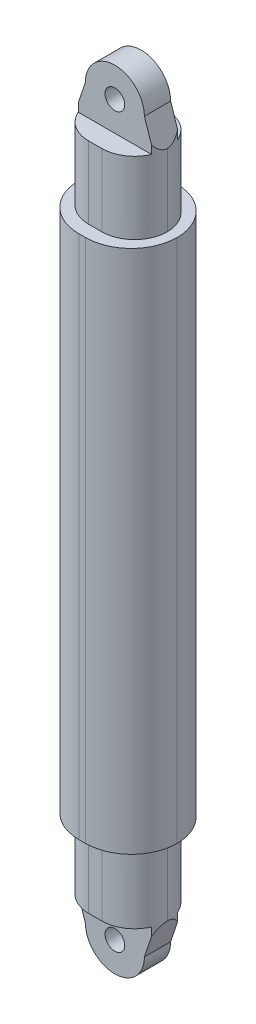
ISO-10303-21;
HEADER;
FILE_DESCRIPTION(('STEP AP214'),'2;1');
FILE_NAME('part.step','',(''),(''),'','','');
FILE_SCHEMA(('AUTOMOTIVE_DESIGN { 1 0 10303 214 1 1 1 1 }'));
ENDSEC;
DATA;
#1=APPLICATION_CONTEXT('core data for automotive mechanical design processes');
#2=APPLICATION_PROTOCOL_DEFINITION('international standard','automotive_design',2000,#1);
#3=PRODUCT_CONTEXT('',#1,'mechanical');
#4=PRODUCT('Part','Part','',(#3));
#5=PRODUCT_RELATED_PRODUCT_CATEGORY('part','',(#4));
#6=PRODUCT_DEFINITION_FORMATION('','',#4);
#7=PRODUCT_DEFINITION_CONTEXT('part definition',#1,'design');
#8=PRODUCT_DEFINITION('design','',#6,#7);
#9=PRODUCT_DEFINITION_SHAPE('','',#8);
#10=(LENGTH_UNIT() NAMED_UNIT(*) SI_UNIT(.MILLI.,.METRE.));
#11=(NAMED_UNIT(*) PLANE_ANGLE_UNIT() SI_UNIT($,.RADIAN.));
#12=(NAMED_UNIT(*) SI_UNIT($,.STERADIAN.) SOLID_ANGLE_UNIT());
#13=UNCERTAINTY_MEASURE_WITH_UNIT(LENGTH_MEASURE(1.E-05),#10,'distance_accuracy_value','');
#14=(GEOMETRIC_REPRESENTATION_CONTEXT(3) GLOBAL_UNCERTAINTY_ASSIGNED_CONTEXT((#13)) GLOBAL_UNIT_ASSIGNED_CONTEXT((#10,
#11,#12)) REPRESENTATION_CONTEXT('',''));
#15=CARTESIAN_POINT('',(0.,0.,0.));
#16=DIRECTION('',(0.,0.,1.));
#17=DIRECTION('',(1.,0.,0.));
#18=AXIS2_PLACEMENT_3D('',#15,#16,#17);
#19=CARTESIAN_POINT('',(-1.,0.,5.));
#20=DIRECTION('',(0.,-1.,0.));
#21=DIRECTION('',(0.,0.,-1.));
#22=AXIS2_PLACEMENT_3D('',#19,#20,#21);
#23=CYLINDRICAL_SURFACE('',#22,5.);
#24=CARTESIAN_POINT('',(-1.,-40.,5.));
#25=DIRECTION('',(0.,-1.,0.));
#26=DIRECTION('',(0.,0.,-1.));
#27=AXIS2_PLACEMENT_3D('',#24,#25,#26);
#28=CIRCLE('',#27,5.);
#29=CARTESIAN_POINT('',(-6.,-40.,5.));
#30=VERTEX_POINT('',#29);
#31=CARTESIAN_POINT('',(-1.,-40.,10.));
#32=VERTEX_POINT('',#31);
#33=EDGE_CURVE('E442',#30,#32,#28,.F.);
#34=ORIENTED_EDGE('',*,*,#33,.F.);
#35=DIRECTION('',(0.,-1.,0.));
#36=VECTOR('',#35,1.);
#37=CARTESIAN_POINT('',(-6.,-60.,5.));
#38=LINE('',#37,#36);
#39=CARTESIAN_POINT('',(-6.,-51.,5.));
#40=VERTEX_POINT('',#39);
#41=EDGE_CURVE('E560',#40,#30,#38,.F.);
#42=ORIENTED_EDGE('',*,*,#41,.F.);
#43=CARTESIAN_POINT('',(-1.,-66.,5.));
#44=DIRECTION('',(0.948683298050514,0.316227766016839,0.));
#45=DIRECTION('',(0.316227766016839,-0.948683298050514,0.));
#46=AXIS2_PLACEMENT_3D('',#43,#44,#45);
#47=ELLIPSE('',#46,15.8113883008419,5.);
#48=CARTESIAN_POINT('',(-5.58257569495584,-52.2522729151325,7.));
#49=VERTEX_POINT('',#48);
#50=EDGE_CURVE('E481',#49,#40,#47,.F.);
#51=ORIENTED_EDGE('',*,*,#50,.F.);
#52=DIRECTION('',(0.,-1.,0.));
#53=VECTOR('',#52,1.);
#54=CARTESIAN_POINT('',(-5.58257569495584,0.,7.));
#55=LINE('',#54,#53);
#56=CARTESIAN_POINT('',(-5.58257569495584,-51.,7.));
#57=VERTEX_POINT('',#56);
#58=EDGE_CURVE('E529',#57,#49,#55,.T.);
#59=ORIENTED_EDGE('',*,*,#58,.F.);
#60=CARTESIAN_POINT('',(-1.,-51.,5.));
#61=DIRECTION('',(0.,-1.,0.));
#62=DIRECTION('',(0.,0.,-1.));
#63=AXIS2_PLACEMENT_3D('',#60,#61,#62);
#64=CIRCLE('',#63,5.);
#65=CARTESIAN_POINT('',(-1.,-51.,10.));
#66=VERTEX_POINT('',#65);
#67=EDGE_CURVE('E534',#57,#66,#64,.F.);
#68=ORIENTED_EDGE('',*,*,#67,.T.);
#69=DIRECTION('',(0.,-1.,0.));
#70=VECTOR('',#69,1.);
#71=CARTESIAN_POINT('',(-1.,0.,10.));
#72=LINE('',#71,#70);
#73=EDGE_CURVE('E551',#32,#66,#72,.T.);
#74=ORIENTED_EDGE('',*,*,#73,.F.);
#75=EDGE_LOOP('',(#34,#42,#51,#59,#68,#74));
#76=FACE_BOUND('',#75,.T.);
#77=ADVANCED_FACE('F139',(#76),#23,.T.);
#78=CARTESIAN_POINT('',(-1.,-60.,5.));
#79=DIRECTION('',(0.,1.,0.));
#80=DIRECTION('',(0.,0.,1.));
#81=AXIS2_PLACEMENT_3D('',#78,#79,#80);
#82=CYLINDRICAL_SURFACE('',#81,5.);
#83=CARTESIAN_POINT('',(-1.,-40.,5.));
#84=DIRECTION('',(0.,-1.,0.));
#85=DIRECTION('',(0.,0.,-1.));
#86=AXIS2_PLACEMENT_3D('',#83,#84,#85);
#87=CIRCLE('',#86,5.);
#88=CARTESIAN_POINT('',(-1.,-40.,0.));
#89=VERTEX_POINT('',#88);
#90=EDGE_CURVE('E439',#89,#30,#87,.F.);
#91=ORIENTED_EDGE('',*,*,#90,.F.);
#92=DIRECTION('',(0.,-1.,0.));
#93=VECTOR('',#92,1.);
#94=CARTESIAN_POINT('',(-1.,60.,0.));
#95=LINE('',#94,#93);
#96=CARTESIAN_POINT('',(-1.,-51.,0.));
#97=VERTEX_POINT('',#96);
#98=EDGE_CURVE('E549',#97,#89,#95,.F.);
#99=ORIENTED_EDGE('',*,*,#98,.F.);
#100=CARTESIAN_POINT('',(-1.,-51.,5.));
#101=DIRECTION('',(0.,-1.,0.));
#102=DIRECTION('',(0.,0.,-1.));
#103=AXIS2_PLACEMENT_3D('',#100,#101,#102);
#104=CIRCLE('',#103,5.);
#105=CARTESIAN_POINT('',(-5.58257569495584,-51.,3.));
#106=VERTEX_POINT('',#105);
#107=EDGE_CURVE('E545',#97,#106,#104,.F.);
#108=ORIENTED_EDGE('',*,*,#107,.T.);
#109=DIRECTION('',(0.,1.,0.));
#110=VECTOR('',#109,1.);
#111=CARTESIAN_POINT('',(-5.58257569495584,-60.,3.));
#112=LINE('',#111,#110);
#113=CARTESIAN_POINT('',(-5.58257569495584,-52.2522729151325,3.));
#114=VERTEX_POINT('',#113);
#115=EDGE_CURVE('E541',#114,#106,#112,.T.);
#116=ORIENTED_EDGE('',*,*,#115,.F.);
#117=CARTESIAN_POINT('',(-1.,-66.,5.));
#118=DIRECTION('',(0.948683298050514,0.316227766016839,0.));
#119=DIRECTION('',(-0.316227766016839,0.948683298050514,0.));
#120=AXIS2_PLACEMENT_3D('',#117,#118,#119);
#121=ELLIPSE('',#120,15.8113883008419,5.);
#122=EDGE_CURVE('E483',#40,#114,#121,.F.);
#123=ORIENTED_EDGE('',*,*,#122,.F.);
#124=ORIENTED_EDGE('',*,*,#41,.T.);
#125=EDGE_LOOP('',(#91,#99,#108,#116,#123,#124));
#126=FACE_BOUND('',#125,.T.);
#127=ADVANCED_FACE('F648',(#126),#82,.T.);
#128=CARTESIAN_POINT('',(0.999999999999998,0.,5.));
#129=DIRECTION('',(0.,1.,0.));
#130=DIRECTION('',(0.,0.,1.));
#131=AXIS2_PLACEMENT_3D('',#128,#129,#130);
#132=CYLINDRICAL_SURFACE('',#131,5.);
#133=CARTESIAN_POINT('',(0.999999999999998,-40.,5.));
#134=DIRECTION('',(0.,-1.,0.));
#135=DIRECTION('',(0.,0.,-1.));
#136=AXIS2_PLACEMENT_3D('',#133,#134,#135);
#137=CIRCLE('',#136,5.);
#138=CARTESIAN_POINT('',(0.999999999999998,-40.,10.));
#139=VERTEX_POINT('',#138);
#140=CARTESIAN_POINT('',(6.,-40.,5.));
#141=VERTEX_POINT('',#140);
#142=EDGE_CURVE('E436',#139,#141,#137,.F.);
#143=ORIENTED_EDGE('',*,*,#142,.F.);
#144=DIRECTION('',(0.,1.,0.));
#145=VECTOR('',#144,1.);
#146=CARTESIAN_POINT('',(0.999999999999998,0.,10.));
#147=LINE('',#146,#145);
#148=CARTESIAN_POINT('',(0.999999999999998,-51.,10.));
#149=VERTEX_POINT('',#148);
#150=EDGE_CURVE('E556',#149,#139,#147,.T.);
#151=ORIENTED_EDGE('',*,*,#150,.F.);
#152=CARTESIAN_POINT('',(0.999999999999998,-51.,5.));
#153=DIRECTION('',(0.,-1.,0.));
#154=DIRECTION('',(0.,0.,-1.));
#155=AXIS2_PLACEMENT_3D('',#152,#153,#154);
#156=CIRCLE('',#155,5.);
#157=CARTESIAN_POINT('',(5.58257569495584,-51.,7.));
#158=VERTEX_POINT('',#157);
#159=EDGE_CURVE('E572',#149,#158,#156,.F.);
#160=ORIENTED_EDGE('',*,*,#159,.T.);
#161=DIRECTION('',(0.,1.,0.));
#162=VECTOR('',#161,1.);
#163=CARTESIAN_POINT('',(5.58257569495584,0.,7.));
#164=LINE('',#163,#162);
#165=CARTESIAN_POINT('',(5.58257569495584,-52.2522729151325,7.));
#166=VERTEX_POINT('',#165);
#167=EDGE_CURVE('E570',#166,#158,#164,.T.);
#168=ORIENTED_EDGE('',*,*,#167,.F.);
#169=CARTESIAN_POINT('',(0.999999999999998,-66.,5.));
#170=DIRECTION('',(0.948683298050514,-0.316227766016838,0.));
#171=DIRECTION('',(0.316227766016838,0.948683298050514,0.));
#172=AXIS2_PLACEMENT_3D('',#169,#170,#171);
#173=ELLIPSE('',#172,15.8113883008419,5.);
#174=CARTESIAN_POINT('',(6.,-51.,5.));
#175=VERTEX_POINT('',#174);
#176=EDGE_CURVE('E491',#166,#175,#173,.F.);
#177=ORIENTED_EDGE('',*,*,#176,.T.);
#178=DIRECTION('',(0.,1.,0.));
#179=VECTOR('',#178,1.);
#180=CARTESIAN_POINT('',(6.,-60.,5.));
#181=LINE('',#180,#179);
#182=EDGE_CURVE('E547',#141,#175,#181,.F.);
#183=ORIENTED_EDGE('',*,*,#182,.F.);
#184=EDGE_LOOP('',(#143,#151,#160,#168,#177,#183));
#185=FACE_BOUND('',#184,.T.);
#186=ADVANCED_FACE('F655',(#185),#132,.T.);
#187=CARTESIAN_POINT('',(0.999999999999998,-60.,5.));
#188=DIRECTION('',(0.,-1.,0.));
#189=DIRECTION('',(0.,0.,-1.));
#190=AXIS2_PLACEMENT_3D('',#187,#188,#189);
#191=CYLINDRICAL_SURFACE('',#190,5.);
#192=CARTESIAN_POINT('',(0.999999999999998,-40.,5.));
#193=DIRECTION('',(0.,-1.,0.));
#194=DIRECTION('',(0.,0.,-1.));
#195=AXIS2_PLACEMENT_3D('',#192,#193,#194);
#196=CIRCLE('',#195,5.);
#197=CARTESIAN_POINT('',(0.999999999999998,-40.,0.));
#198=VERTEX_POINT('',#197);
#199=EDGE_CURVE('E433',#141,#198,#196,.F.);
#200=ORIENTED_EDGE('',*,*,#199,.F.);
#201=ORIENTED_EDGE('',*,*,#182,.T.);
#202=CARTESIAN_POINT('',(0.999999999999998,-66.,5.));
#203=DIRECTION('',(0.948683298050514,-0.316227766016838,0.));
#204=DIRECTION('',(-0.316227766016838,-0.948683298050514,0.));
#205=AXIS2_PLACEMENT_3D('',#202,#203,#204);
#206=ELLIPSE('',#205,15.8113883008419,5.);
#207=CARTESIAN_POINT('',(5.58257569495584,-52.2522729151325,3.));
#208=VERTEX_POINT('',#207);
#209=EDGE_CURVE('E494',#175,#208,#206,.F.);
#210=ORIENTED_EDGE('',*,*,#209,.T.);
#211=DIRECTION('',(0.,-1.,0.));
#212=VECTOR('',#211,1.);
#213=CARTESIAN_POINT('',(5.58257569495584,-60.,3.));
#214=LINE('',#213,#212);
#215=CARTESIAN_POINT('',(5.58257569495584,-51.,3.));
#216=VERTEX_POINT('',#215);
#217=EDGE_CURVE('E559',#216,#208,#214,.T.);
#218=ORIENTED_EDGE('',*,*,#217,.F.);
#219=CARTESIAN_POINT('',(0.999999999999998,-51.,5.));
#220=DIRECTION('',(0.,-1.,0.));
#221=DIRECTION('',(0.,0.,-1.));
#222=AXIS2_PLACEMENT_3D('',#219,#220,#221);
#223=CIRCLE('',#222,5.);
#224=CARTESIAN_POINT('',(0.999999999999998,-51.,0.));
#225=VERTEX_POINT('',#224);
#226=EDGE_CURVE('E567',#216,#225,#223,.F.);
#227=ORIENTED_EDGE('',*,*,#226,.T.);
#228=DIRECTION('',(0.,1.,0.));
#229=VECTOR('',#228,1.);
#230=CARTESIAN_POINT('',(0.999999999999998,-60.,0.));
#231=LINE('',#230,#229);
#232=EDGE_CURVE('E348',#198,#225,#231,.F.);
#233=ORIENTED_EDGE('',*,*,#232,.F.);
#234=EDGE_LOOP('',(#200,#201,#210,#218,#227,#233));
#235=FACE_BOUND('',#234,.T.);
#236=ADVANCED_FACE('F718',(#235),#191,.T.);
#237=CARTESIAN_POINT('',(0.,0.,10.));
#238=DIRECTION('',(0.,0.,-1.));
#239=DIRECTION('',(-1.,0.,0.));
#240=AXIS2_PLACEMENT_3D('',#237,#238,#239);
#241=PLANE('',#240);
#242=ORIENTED_EDGE('',*,*,#150,.T.);
#243=DIRECTION('',(-1.,0.,0.));
#244=VECTOR('',#243,1.);
#245=CARTESIAN_POINT('',(0.,-40.,10.));
#246=LINE('',#245,#244);
#247=EDGE_CURVE('E445',#139,#32,#246,.T.);
#248=ORIENTED_EDGE('',*,*,#247,.T.);
#249=ORIENTED_EDGE('',*,*,#73,.T.);
#250=DIRECTION('',(-1.,0.,0.));
#251=VECTOR('',#250,1.);
#252=CARTESIAN_POINT('',(6.,-51.,10.));
#253=LINE('',#252,#251);
#254=EDGE_CURVE('E526',#149,#66,#253,.T.);
#255=ORIENTED_EDGE('',*,*,#254,.F.);
#256=EDGE_LOOP('',(#242,#248,#249,#255));
#257=FACE_BOUND('',#256,.T.);
#258=ADVANCED_FACE('F642',(#257),#241,.F.);
#259=CARTESIAN_POINT('',(0.,0.,0.));
#260=DIRECTION('',(0.,0.,-1.));
#261=DIRECTION('',(-1.,0.,0.));
#262=AXIS2_PLACEMENT_3D('',#259,#260,#261);
#263=PLANE('',#262);
#264=DIRECTION('',(-1.,0.,0.));
#265=VECTOR('',#264,1.);
#266=CARTESIAN_POINT('',(0.,-40.,0.));
#267=LINE('',#266,#265);
#268=EDGE_CURVE('E367',#198,#89,#267,.T.);
#269=ORIENTED_EDGE('',*,*,#268,.F.);
#270=ORIENTED_EDGE('',*,*,#232,.T.);
#271=DIRECTION('',(-1.,0.,0.));
#272=VECTOR('',#271,1.);
#273=CARTESIAN_POINT('',(0.,-51.,0.));
#274=LINE('',#273,#272);
#275=EDGE_CURVE('E537',#225,#97,#274,.T.);
#276=ORIENTED_EDGE('',*,*,#275,.T.);
#277=ORIENTED_EDGE('',*,*,#98,.T.);
#278=EDGE_LOOP('',(#269,#270,#276,#277));
#279=FACE_BOUND('',#278,.T.);
#280=ADVANCED_FACE('F675',(#279),#263,.T.);
#281=CARTESIAN_POINT('',(0.,-51.,3.));
#282=DIRECTION('',(0.,-1.,0.));
#283=DIRECTION('',(0.,0.,-1.));
#284=AXIS2_PLACEMENT_3D('',#281,#282,#283);
#285=PLANE('',#284);
#286=ORIENTED_EDGE('',*,*,#275,.F.);
#287=ORIENTED_EDGE('',*,*,#226,.F.);
#288=DIRECTION('',(-1.,0.,0.));
#289=VECTOR('',#288,1.);
#290=CARTESIAN_POINT('',(0.,-51.,3.));
#291=LINE('',#290,#289);
#292=EDGE_CURVE('E538',#216,#106,#291,.T.);
#293=ORIENTED_EDGE('',*,*,#292,.T.);
#294=ORIENTED_EDGE('',*,*,#107,.F.);
#295=EDGE_LOOP('',(#286,#287,#293,#294));
#296=FACE_BOUND('',#295,.T.);
#297=ADVANCED_FACE('F677',(#296),#285,.T.);
#298=CARTESIAN_POINT('',(0.,0.,3.));
#299=DIRECTION('',(0.,0.,1.));
#300=DIRECTION('',(1.,0.,0.));
#301=AXIS2_PLACEMENT_3D('',#298,#299,#300);
#302=PLANE('',#301);
#303=CARTESIAN_POINT('',(0.,-55.5,3.));
#304=DIRECTION('',(0.,0.,-1.));
#305=DIRECTION('',(-1.,0.,0.));
#306=AXIS2_PLACEMENT_3D('',#303,#304,#305);
#307=CIRCLE('',#306,1.5);
#308=CARTESIAN_POINT('',(-1.5,-55.5,3.));
#309=VERTEX_POINT('',#308);
#310=EDGE_CURVE('E474',#309,#309,#307,.T.);
#311=ORIENTED_EDGE('',*,*,#310,.F.);
#312=EDGE_LOOP('',(#311));
#313=FACE_BOUND('',#312,.T.);
#314=CARTESIAN_POINT('',(0.,-55.5,3.));
#315=DIRECTION('',(0.,0.,1.));
#316=DIRECTION('',(1.,0.,0.));
#317=AXIS2_PLACEMENT_3D('',#314,#315,#316);
#318=CIRCLE('',#317,4.5);
#319=CARTESIAN_POINT('',(4.5,-55.5,3.));
#320=VERTEX_POINT('',#319);
#321=CARTESIAN_POINT('',(-4.5,-55.5,3.));
#322=VERTEX_POINT('',#321);
#323=EDGE_CURVE('E499',#320,#322,#318,.F.);
#324=ORIENTED_EDGE('',*,*,#323,.T.);
#325=DIRECTION('',(-0.316227766016839,0.948683298050514,0.));
#326=VECTOR('',#325,1.);
#327=CARTESIAN_POINT('',(-20.7,-6.90000000000002,3.));
#328=LINE('',#327,#326);
#329=EDGE_CURVE('E485',#322,#114,#328,.T.);
#330=ORIENTED_EDGE('',*,*,#329,.T.);
#331=ORIENTED_EDGE('',*,*,#115,.T.);
#332=ORIENTED_EDGE('',*,*,#292,.F.);
#333=ORIENTED_EDGE('',*,*,#217,.T.);
#334=DIRECTION('',(0.316227766016838,0.948683298050514,0.));
#335=VECTOR('',#334,1.);
#336=CARTESIAN_POINT('',(20.7,-6.90000000000001,3.));
#337=LINE('',#336,#335);
#338=EDGE_CURVE('E497',#320,#208,#337,.T.);
#339=ORIENTED_EDGE('',*,*,#338,.F.);
#340=EDGE_LOOP('',(#324,#330,#331,#332,#333,#339));
#341=FACE_BOUND('',#340,.T.);
#342=ADVANCED_FACE('F680',(#313,#341),#302,.F.);
#343=CARTESIAN_POINT('',(6.,-51.,10.));
#344=DIRECTION('',(0.,-1.,0.));
#345=DIRECTION('',(0.,0.,-1.));
#346=AXIS2_PLACEMENT_3D('',#343,#344,#345);
#347=PLANE('',#346);
#348=DIRECTION('',(-1.,0.,0.));
#349=VECTOR('',#348,1.);
#350=CARTESIAN_POINT('',(6.,-51.,7.));
#351=LINE('',#350,#349);
#352=EDGE_CURVE('E525',#158,#57,#351,.T.);
#353=ORIENTED_EDGE('',*,*,#352,.F.);
#354=ORIENTED_EDGE('',*,*,#159,.F.);
#355=ORIENTED_EDGE('',*,*,#254,.T.);
#356=ORIENTED_EDGE('',*,*,#67,.F.);
#357=EDGE_LOOP('',(#353,#354,#355,#356));
#358=FACE_BOUND('',#357,.T.);
#359=ADVANCED_FACE('F684',(#358),#347,.T.);
#360=CARTESIAN_POINT('',(0.,0.,7.));
#361=DIRECTION('',(0.,0.,-1.));
#362=DIRECTION('',(-1.,0.,0.));
#363=AXIS2_PLACEMENT_3D('',#360,#361,#362);
#364=PLANE('',#363);
#365=CARTESIAN_POINT('',(0.,-55.5,7.));
#366=DIRECTION('',(0.,0.,-1.));
#367=DIRECTION('',(-1.,0.,0.));
#368=AXIS2_PLACEMENT_3D('',#365,#366,#367);
#369=CIRCLE('',#368,1.5);
#370=CARTESIAN_POINT('',(-1.5,-55.5,7.));
#371=VERTEX_POINT('',#370);
#372=EDGE_CURVE('E477',#371,#371,#369,.T.);
#373=ORIENTED_EDGE('',*,*,#372,.T.);
#374=EDGE_LOOP('',(#373));
#375=FACE_BOUND('',#374,.T.);
#376=DIRECTION('',(0.316227766016839,-0.948683298050514,0.));
#377=VECTOR('',#376,1.);
#378=CARTESIAN_POINT('',(-20.7,-6.90000000000002,7.));
#379=LINE('',#378,#377);
#380=CARTESIAN_POINT('',(-4.5,-55.5,7.));
#381=VERTEX_POINT('',#380);
#382=EDGE_CURVE('E584',#49,#381,#379,.T.);
#383=ORIENTED_EDGE('',*,*,#382,.T.);
#384=CARTESIAN_POINT('',(0.,-55.5,7.));
#385=DIRECTION('',(0.,0.,-1.));
#386=DIRECTION('',(-1.,0.,0.));
#387=AXIS2_PLACEMENT_3D('',#384,#385,#386);
#388=CIRCLE('',#387,4.5);
#389=CARTESIAN_POINT('',(4.5,-55.5,7.));
#390=VERTEX_POINT('',#389);
#391=EDGE_CURVE('E581',#381,#390,#388,.F.);
#392=ORIENTED_EDGE('',*,*,#391,.T.);
#393=DIRECTION('',(-0.316227766016838,-0.948683298050514,0.));
#394=VECTOR('',#393,1.);
#395=CARTESIAN_POINT('',(20.7,-6.90000000000001,7.));
#396=LINE('',#395,#394);
#397=EDGE_CURVE('E579',#166,#390,#396,.T.);
#398=ORIENTED_EDGE('',*,*,#397,.F.);
#399=ORIENTED_EDGE('',*,*,#167,.T.);
#400=ORIENTED_EDGE('',*,*,#352,.T.);
#401=ORIENTED_EDGE('',*,*,#58,.T.);
#402=EDGE_LOOP('',(#383,#392,#398,#399,#400,#401));
#403=FACE_BOUND('',#402,.T.);
#404=ADVANCED_FACE('F686',(#375,#403),#364,.F.);
#405=CARTESIAN_POINT('',(0.,-55.5,10.));
#406=DIRECTION('',(0.,0.,-1.));
#407=DIRECTION('',(-1.,0.,0.));
#408=AXIS2_PLACEMENT_3D('',#405,#406,#407);
#409=CYLINDRICAL_SURFACE('',#408,4.5);
#410=DIRECTION('',(0.,0.,-1.));
#411=VECTOR('',#410,1.);
#412=CARTESIAN_POINT('',(4.5,-55.5,10.));
#413=LINE('',#412,#411);
#414=EDGE_CURVE('E488',#390,#320,#413,.T.);
#415=ORIENTED_EDGE('',*,*,#414,.F.);
#416=ORIENTED_EDGE('',*,*,#391,.F.);
#417=DIRECTION('',(0.,0.,-1.));
#418=VECTOR('',#417,1.);
#419=CARTESIAN_POINT('',(-4.5,-55.5,10.));
#420=LINE('',#419,#418);
#421=EDGE_CURVE('E478',#381,#322,#420,.T.);
#422=ORIENTED_EDGE('',*,*,#421,.T.);
#423=ORIENTED_EDGE('',*,*,#323,.F.);
#424=EDGE_LOOP('',(#415,#416,#422,#423));
#425=FACE_BOUND('',#424,.T.);
#426=ADVANCED_FACE('F689',(#425),#409,.T.);
#427=CARTESIAN_POINT('',(20.7,-6.90000000000001,10.));
#428=DIRECTION('',(0.948683298050514,-0.316227766016838,0.));
#429=DIRECTION('',(0.316227766016838,0.948683298050514,0.));
#430=AXIS2_PLACEMENT_3D('',#427,#428,#429);
#431=PLANE('',#430);
#432=ORIENTED_EDGE('',*,*,#338,.T.);
#433=ORIENTED_EDGE('',*,*,#209,.F.);
#434=ORIENTED_EDGE('',*,*,#176,.F.);
#435=ORIENTED_EDGE('',*,*,#397,.T.);
#436=ORIENTED_EDGE('',*,*,#414,.T.);
#437=EDGE_LOOP('',(#432,#433,#434,#435,#436));
#438=FACE_BOUND('',#437,.T.);
#439=ADVANCED_FACE('F695',(#438),#431,.T.);
#440=CARTESIAN_POINT('',(-20.7,-6.90000000000002,10.));
#441=DIRECTION('',(0.948683298050514,0.316227766016839,0.));
#442=DIRECTION('',(-0.316227766016839,0.948683298050514,0.));
#443=AXIS2_PLACEMENT_3D('',#440,#441,#442);
#444=PLANE('',#443);
#445=ORIENTED_EDGE('',*,*,#421,.F.);
#446=ORIENTED_EDGE('',*,*,#382,.F.);
#447=ORIENTED_EDGE('',*,*,#50,.T.);
#448=ORIENTED_EDGE('',*,*,#122,.T.);
#449=ORIENTED_EDGE('',*,*,#329,.F.);
#450=EDGE_LOOP('',(#445,#446,#447,#448,#449));
#451=FACE_BOUND('',#450,.T.);
#452=ADVANCED_FACE('F705',(#451),#444,.F.);
#453=CARTESIAN_POINT('',(0.,-55.5,10.));
#454=DIRECTION('',(0.,0.,-1.));
#455=DIRECTION('',(-1.,0.,0.));
#456=AXIS2_PLACEMENT_3D('',#453,#454,#455);
#457=CYLINDRICAL_SURFACE('',#456,1.5);
#458=ORIENTED_EDGE('',*,*,#310,.T.);
#459=EDGE_LOOP('',(#458));
#460=FACE_BOUND('',#459,.T.);
#461=ORIENTED_EDGE('',*,*,#372,.F.);
#462=EDGE_LOOP('',(#461));
#463=FACE_BOUND('',#462,.T.);
#464=ADVANCED_FACE('F779',(#460,#463),#457,.F.);
#465=CARTESIAN_POINT('',(-7.50000000000001,-40.,-2.));
#466=DIRECTION('',(0.,-1.,0.));
#467=DIRECTION('',(0.,0.,-1.));
#468=AXIS2_PLACEMENT_3D('',#465,#466,#467);
#469=PLANE('',#468);
#470=CARTESIAN_POINT('',(0.500000000000027,-40.,5.));
#471=DIRECTION('',(0.,-1.,0.));
#472=DIRECTION('',(0.,0.,-1.));
#473=AXIS2_PLACEMENT_3D('',#470,#471,#472);
#474=CIRCLE('',#473,7.);
#475=CARTESIAN_POINT('',(0.500000000000028,-40.,-2.));
#476=VERTEX_POINT('',#475);
#477=CARTESIAN_POINT('',(7.50000000000003,-40.,5.));
#478=VERTEX_POINT('',#477);
#479=EDGE_CURVE('E387',#476,#478,#474,.T.);
#480=ORIENTED_EDGE('',*,*,#479,.T.);
#481=CARTESIAN_POINT('',(0.500000000000027,-40.,5.));
#482=DIRECTION('',(0.,-1.,0.));
#483=DIRECTION('',(0.,0.,-1.));
#484=AXIS2_PLACEMENT_3D('',#481,#482,#483);
#485=CIRCLE('',#484,7.);
#486=CARTESIAN_POINT('',(0.500000000000028,-40.,12.));
#487=VERTEX_POINT('',#486);
#488=EDGE_CURVE('E389',#478,#487,#485,.T.);
#489=ORIENTED_EDGE('',*,*,#488,.T.);
#490=DIRECTION('',(1.,0.,0.));
#491=VECTOR('',#490,1.);
#492=CARTESIAN_POINT('',(-7.50000000000001,-40.,12.));
#493=LINE('',#492,#491);
#494=CARTESIAN_POINT('',(-0.50000000000001,-40.,12.));
#495=VERTEX_POINT('',#494);
#496=EDGE_CURVE('E405',#495,#487,#493,.T.);
#497=ORIENTED_EDGE('',*,*,#496,.F.);
#498=CARTESIAN_POINT('',(-0.50000000000001,-40.,5.));
#499=DIRECTION('',(0.,-1.,0.));
#500=DIRECTION('',(0.,0.,-1.));
#501=AXIS2_PLACEMENT_3D('',#498,#499,#500);
#502=CIRCLE('',#501,7.);
#503=CARTESIAN_POINT('',(-7.50000000000001,-40.,5.));
#504=VERTEX_POINT('',#503);
#505=EDGE_CURVE('E385',#495,#504,#502,.T.);
#506=ORIENTED_EDGE('',*,*,#505,.T.);
#507=CARTESIAN_POINT('',(-0.50000000000001,-40.,5.));
#508=DIRECTION('',(0.,-1.,0.));
#509=DIRECTION('',(0.,0.,-1.));
#510=AXIS2_PLACEMENT_3D('',#507,#508,#509);
#511=CIRCLE('',#510,7.);
#512=CARTESIAN_POINT('',(-0.50000000000001,-40.,-2.));
#513=VERTEX_POINT('',#512);
#514=EDGE_CURVE('E383',#504,#513,#511,.T.);
#515=ORIENTED_EDGE('',*,*,#514,.T.);
#516=DIRECTION('',(1.,0.,0.));
#517=VECTOR('',#516,1.);
#518=CARTESIAN_POINT('',(-7.50000000000001,-40.,-2.));
#519=LINE('',#518,#517);
#520=EDGE_CURVE('E360',#513,#476,#519,.T.);
#521=ORIENTED_EDGE('',*,*,#520,.T.);
#522=EDGE_LOOP('',(#480,#489,#497,#506,#515,#521));
#523=FACE_BOUND('',#522,.T.);
#524=ORIENTED_EDGE('',*,*,#247,.F.);
#525=ORIENTED_EDGE('',*,*,#142,.T.);
#526=ORIENTED_EDGE('',*,*,#199,.T.);
#527=ORIENTED_EDGE('',*,*,#268,.T.);
#528=ORIENTED_EDGE('',*,*,#90,.T.);
#529=ORIENTED_EDGE('',*,*,#33,.T.);
#530=EDGE_LOOP('',(#524,#525,#526,#527,#528,#529));
#531=FACE_BOUND('',#530,.T.);
#532=ADVANCED_FACE('F420',(#523,#531),#469,.T.);
#533=CARTESIAN_POINT('',(-7.5,40.,-2.));
#534=DIRECTION('',(0.,1.,0.));
#535=DIRECTION('',(0.,0.,1.));
#536=AXIS2_PLACEMENT_3D('',#533,#534,#535);
#537=PLANE('',#536);
#538=DIRECTION('',(-1.,0.,0.));
#539=VECTOR('',#538,1.);
#540=CARTESIAN_POINT('',(-7.5,40.,12.));
#541=LINE('',#540,#539);
#542=CARTESIAN_POINT('',(0.500000000000004,40.,12.));
#543=VERTEX_POINT('',#542);
#544=CARTESIAN_POINT('',(-0.499999999999996,40.,12.));
#545=VERTEX_POINT('',#544);
#546=EDGE_CURVE('E400',#543,#545,#541,.T.);
#547=ORIENTED_EDGE('',*,*,#546,.F.);
#548=CARTESIAN_POINT('',(0.500000000000003,40.,5.));
#549=DIRECTION('',(0.,1.,0.));
#550=DIRECTION('',(0.,0.,1.));
#551=AXIS2_PLACEMENT_3D('',#548,#549,#550);
#552=CIRCLE('',#551,7.);
#553=CARTESIAN_POINT('',(7.5,40.,5.));
#554=VERTEX_POINT('',#553);
#555=EDGE_CURVE('E396',#543,#554,#552,.T.);
#556=ORIENTED_EDGE('',*,*,#555,.T.);
#557=CARTESIAN_POINT('',(0.500000000000003,40.,5.));
#558=DIRECTION('',(0.,1.,0.));
#559=DIRECTION('',(0.,0.,1.));
#560=AXIS2_PLACEMENT_3D('',#557,#558,#559);
#561=CIRCLE('',#560,7.);
#562=CARTESIAN_POINT('',(0.500000000000004,40.,-2.));
#563=VERTEX_POINT('',#562);
#564=EDGE_CURVE('E162',#554,#563,#561,.T.);
#565=ORIENTED_EDGE('',*,*,#564,.T.);
#566=DIRECTION('',(-1.,0.,0.));
#567=VECTOR('',#566,1.);
#568=CARTESIAN_POINT('',(-7.5,40.,-2.));
#569=LINE('',#568,#567);
#570=CARTESIAN_POINT('',(-0.499999999999996,40.,-2.));
#571=VERTEX_POINT('',#570);
#572=EDGE_CURVE('E418',#563,#571,#569,.T.);
#573=ORIENTED_EDGE('',*,*,#572,.T.);
#574=CARTESIAN_POINT('',(-0.499999999999996,40.,5.));
#575=DIRECTION('',(0.,1.,0.));
#576=DIRECTION('',(0.,0.,1.));
#577=AXIS2_PLACEMENT_3D('',#574,#575,#576);
#578=CIRCLE('',#577,7.);
#579=CARTESIAN_POINT('',(-7.5,40.,5.));
#580=VERTEX_POINT('',#579);
#581=EDGE_CURVE('E391',#571,#580,#578,.T.);
#582=ORIENTED_EDGE('',*,*,#581,.T.);
#583=CARTESIAN_POINT('',(-0.499999999999996,40.,5.));
#584=DIRECTION('',(0.,1.,0.));
#585=DIRECTION('',(0.,0.,1.));
#586=AXIS2_PLACEMENT_3D('',#583,#584,#585);
#587=CIRCLE('',#586,7.);
#588=EDGE_CURVE('E393',#580,#545,#587,.T.);
#589=ORIENTED_EDGE('',*,*,#588,.T.);
#590=EDGE_LOOP('',(#547,#556,#565,#573,#582,#589));
#591=FACE_BOUND('',#590,.T.);
#592=DIRECTION('',(1.,0.,0.));
#593=VECTOR('',#592,1.);
#594=CARTESIAN_POINT('',(0.,40.,10.));
#595=LINE('',#594,#593);
#596=CARTESIAN_POINT('',(-1.,40.,10.));
#597=VERTEX_POINT('',#596);
#598=CARTESIAN_POINT('',(0.999999999999998,40.,10.));
#599=VERTEX_POINT('',#598);
#600=EDGE_CURVE('E431',#597,#599,#595,.T.);
#601=ORIENTED_EDGE('',*,*,#600,.F.);
#602=CARTESIAN_POINT('',(-1.,40.,5.));
#603=DIRECTION('',(0.,1.,0.));
#604=DIRECTION('',(0.,0.,1.));
#605=AXIS2_PLACEMENT_3D('',#602,#603,#604);
#606=CIRCLE('',#605,5.);
#607=CARTESIAN_POINT('',(-6.,40.,5.));
#608=VERTEX_POINT('',#607);
#609=EDGE_CURVE('E429',#597,#608,#606,.F.);
#610=ORIENTED_EDGE('',*,*,#609,.T.);
#611=CARTESIAN_POINT('',(-1.,40.,5.));
#612=DIRECTION('',(0.,1.,0.));
#613=DIRECTION('',(0.,0.,1.));
#614=AXIS2_PLACEMENT_3D('',#611,#612,#613);
#615=CIRCLE('',#614,5.);
#616=CARTESIAN_POINT('',(-1.,40.,0.));
#617=VERTEX_POINT('',#616);
#618=EDGE_CURVE('E366',#608,#617,#615,.F.);
#619=ORIENTED_EDGE('',*,*,#618,.T.);
#620=DIRECTION('',(1.,0.,0.));
#621=VECTOR('',#620,1.);
#622=CARTESIAN_POINT('',(0.,40.,0.));
#623=LINE('',#622,#621);
#624=CARTESIAN_POINT('',(0.999999999999998,40.,0.));
#625=VERTEX_POINT('',#624);
#626=EDGE_CURVE('E341',#617,#625,#623,.T.);
#627=ORIENTED_EDGE('',*,*,#626,.T.);
#628=CARTESIAN_POINT('',(0.999999999999998,40.,5.));
#629=DIRECTION('',(0.,1.,0.));
#630=DIRECTION('',(0.,0.,1.));
#631=AXIS2_PLACEMENT_3D('',#628,#629,#630);
#632=CIRCLE('',#631,5.);
#633=CARTESIAN_POINT('',(6.,40.,5.));
#634=VERTEX_POINT('',#633);
#635=EDGE_CURVE('E352',#625,#634,#632,.F.);
#636=ORIENTED_EDGE('',*,*,#635,.T.);
#637=CARTESIAN_POINT('',(0.999999999999998,40.,5.));
#638=DIRECTION('',(0.,1.,0.));
#639=DIRECTION('',(0.,0.,1.));
#640=AXIS2_PLACEMENT_3D('',#637,#638,#639);
#641=CIRCLE('',#640,5.);
#642=EDGE_CURVE('E359',#634,#599,#641,.F.);
#643=ORIENTED_EDGE('',*,*,#642,.T.);
#644=EDGE_LOOP('',(#601,#610,#619,#627,#636,#643));
#645=FACE_BOUND('',#644,.T.);
#646=ADVANCED_FACE('F364',(#591,#645),#537,.T.);
#647=CARTESIAN_POINT('',(0.,0.,-2.));
#648=DIRECTION('',(0.,0.,-1.));
#649=DIRECTION('',(-1.,0.,0.));
#650=AXIS2_PLACEMENT_3D('',#647,#648,#649);
#651=PLANE('',#650);
#652=ORIENTED_EDGE('',*,*,#572,.F.);
#653=DIRECTION('',(0.,1.,0.));
#654=VECTOR('',#653,1.);
#655=CARTESIAN_POINT('',(0.500000000000015,0.,-2.));
#656=LINE('',#655,#654);
#657=EDGE_CURVE('E12',#563,#476,#656,.F.);
#658=ORIENTED_EDGE('',*,*,#657,.T.);
#659=ORIENTED_EDGE('',*,*,#520,.F.);
#660=DIRECTION('',(0.,-1.,0.));
#661=VECTOR('',#660,1.);
#662=CARTESIAN_POINT('',(-0.500000000000003,0.,-2.));
#663=LINE('',#662,#661);
#664=EDGE_CURVE('E148',#513,#571,#663,.F.);
#665=ORIENTED_EDGE('',*,*,#664,.T.);
#666=EDGE_LOOP('',(#652,#658,#659,#665));
#667=FACE_BOUND('',#666,.T.);
#668=ADVANCED_FACE('F417',(#667),#651,.T.);
#669=CARTESIAN_POINT('',(0.,0.,12.));
#670=DIRECTION('',(0.,0.,-1.));
#671=DIRECTION('',(-1.,0.,0.));
#672=AXIS2_PLACEMENT_3D('',#669,#670,#671);
#673=PLANE('',#672);
#674=ORIENTED_EDGE('',*,*,#546,.T.);
#675=DIRECTION('',(0.,-1.,0.));
#676=VECTOR('',#675,1.);
#677=CARTESIAN_POINT('',(-0.50000000000001,-40.,12.));
#678=LINE('',#677,#676);
#679=EDGE_CURVE('E380',#545,#495,#678,.T.);
#680=ORIENTED_EDGE('',*,*,#679,.T.);
#681=ORIENTED_EDGE('',*,*,#496,.T.);
#682=DIRECTION('',(0.,1.,0.));
#683=VECTOR('',#682,1.);
#684=CARTESIAN_POINT('',(0.500000000000003,40.,12.));
#685=LINE('',#684,#683);
#686=EDGE_CURVE('E371',#487,#543,#685,.T.);
#687=ORIENTED_EDGE('',*,*,#686,.T.);
#688=EDGE_LOOP('',(#674,#680,#681,#687));
#689=FACE_BOUND('',#688,.T.);
#690=ADVANCED_FACE('F837',(#689),#673,.F.);
#691=CARTESIAN_POINT('',(0.,55.5,10.));
#692=DIRECTION('',(0.,0.,-1.));
#693=DIRECTION('',(-1.,0.,0.));
#694=AXIS2_PLACEMENT_3D('',#691,#692,#693);
#695=CYLINDRICAL_SURFACE('',#694,4.5);
#696=CARTESIAN_POINT('',(0.,55.5,3.));
#697=DIRECTION('',(0.,0.,1.));
#698=DIRECTION('',(1.,0.,0.));
#699=AXIS2_PLACEMENT_3D('',#696,#697,#698);
#700=CIRCLE('',#699,4.5);
#701=CARTESIAN_POINT('',(4.5,55.5,3.));
#702=VERTEX_POINT('',#701);
#703=CARTESIAN_POINT('',(-4.5,55.5,3.));
#704=VERTEX_POINT('',#703);
#705=EDGE_CURVE('E468',#702,#704,#700,.T.);
#706=ORIENTED_EDGE('',*,*,#705,.T.);
#707=DIRECTION('',(0.,0.,-1.));
#708=VECTOR('',#707,1.);
#709=CARTESIAN_POINT('',(-4.5,55.5,10.));
#710=LINE('',#709,#708);
#711=CARTESIAN_POINT('',(-4.5,55.5,7.));
#712=VERTEX_POINT('',#711);
#713=EDGE_CURVE('E447',#712,#704,#710,.T.);
#714=ORIENTED_EDGE('',*,*,#713,.F.);
#715=CARTESIAN_POINT('',(0.,55.5,7.));
#716=DIRECTION('',(0.,0.,-1.));
#717=DIRECTION('',(-1.,0.,0.));
#718=AXIS2_PLACEMENT_3D('',#715,#716,#717);
#719=CIRCLE('',#718,4.5);
#720=CARTESIAN_POINT('',(4.5,55.5,7.));
#721=VERTEX_POINT('',#720);
#722=EDGE_CURVE('E374',#712,#721,#719,.T.);
#723=ORIENTED_EDGE('',*,*,#722,.T.);
#724=DIRECTION('',(0.,0.,-1.));
#725=VECTOR('',#724,1.);
#726=CARTESIAN_POINT('',(4.5,55.5,10.));
#727=LINE('',#726,#725);
#728=EDGE_CURVE('E458',#721,#702,#727,.T.);
#729=ORIENTED_EDGE('',*,*,#728,.T.);
#730=EDGE_LOOP('',(#706,#714,#723,#729));
#731=FACE_BOUND('',#730,.T.);
#732=ADVANCED_FACE('F596',(#731),#695,.T.);
#733=CARTESIAN_POINT('',(0.,55.5,10.));
#734=DIRECTION('',(0.,0.,-1.));
#735=DIRECTION('',(-1.,0.,0.));
#736=AXIS2_PLACEMENT_3D('',#733,#734,#735);
#737=CYLINDRICAL_SURFACE('',#736,1.5);
#738=CARTESIAN_POINT('',(0.,55.5,3.));
#739=DIRECTION('',(0.,0.,1.));
#740=DIRECTION('',(-1.,0.,0.));
#741=AXIS2_PLACEMENT_3D('',#738,#739,#740);
#742=CIRCLE('',#741,1.5);
#743=CARTESIAN_POINT('',(-1.5,55.5,3.));
#744=VERTEX_POINT('',#743);
#745=EDGE_CURVE('E470',#744,#744,#742,.T.);
#746=ORIENTED_EDGE('',*,*,#745,.F.);
#747=EDGE_LOOP('',(#746));
#748=FACE_BOUND('',#747,.T.);
#749=CARTESIAN_POINT('',(0.,55.5,7.));
#750=DIRECTION('',(0.,0.,-1.));
#751=DIRECTION('',(-1.,0.,0.));
#752=AXIS2_PLACEMENT_3D('',#749,#750,#751);
#753=CIRCLE('',#752,1.5);
#754=CARTESIAN_POINT('',(-1.5,55.5,7.));
#755=VERTEX_POINT('',#754);
#756=EDGE_CURVE('E473',#755,#755,#753,.F.);
#757=ORIENTED_EDGE('',*,*,#756,.T.);
#758=EDGE_LOOP('',(#757));
#759=FACE_BOUND('',#758,.T.);
#760=ADVANCED_FACE('F793',(#748,#759),#737,.F.);
#761=CARTESIAN_POINT('',(-20.7,6.90000000000002,10.));
#762=DIRECTION('',(-0.948683298050514,0.316227766016839,0.));
#763=DIRECTION('',(-0.316227766016839,-0.948683298050514,0.));
#764=AXIS2_PLACEMENT_3D('',#761,#762,#763);
#765=PLANE('',#764);
#766=DIRECTION('',(-0.316227766016839,-0.948683298050514,0.));
#767=VECTOR('',#766,1.);
#768=CARTESIAN_POINT('',(-20.7,6.90000000000002,3.));
#769=LINE('',#768,#767);
#770=CARTESIAN_POINT('',(-5.58257569495584,52.2522729151325,3.));
#771=VERTEX_POINT('',#770);
#772=EDGE_CURVE('E456',#704,#771,#769,.T.);
#773=ORIENTED_EDGE('',*,*,#772,.T.);
#774=CARTESIAN_POINT('',(-1.,65.9999999999999,5.));
#775=DIRECTION('',(-0.948683298050514,0.316227766016839,0.));
#776=DIRECTION('',(0.316227766016839,0.948683298050514,0.));
#777=AXIS2_PLACEMENT_3D('',#774,#775,#776);
#778=ELLIPSE('',#777,15.8113883008419,5.);
#779=CARTESIAN_POINT('',(-6.,51.,5.));
#780=VERTEX_POINT('',#779);
#781=EDGE_CURVE('E368',#780,#771,#778,.F.);
#782=ORIENTED_EDGE('',*,*,#781,.F.);
#783=CARTESIAN_POINT('',(-1.,66.,5.));
#784=DIRECTION('',(-0.948683298050514,0.316227766016839,0.));
#785=DIRECTION('',(-0.316227766016839,-0.948683298050514,0.));
#786=AXIS2_PLACEMENT_3D('',#783,#784,#785);
#787=ELLIPSE('',#786,15.8113883008419,5.);
#788=CARTESIAN_POINT('',(-5.58257569495584,52.2522729151325,7.));
#789=VERTEX_POINT('',#788);
#790=EDGE_CURVE('E450',#789,#780,#787,.F.);
#791=ORIENTED_EDGE('',*,*,#790,.F.);
#792=DIRECTION('',(0.316227766016839,0.948683298050514,0.));
#793=VECTOR('',#792,1.);
#794=CARTESIAN_POINT('',(-20.7,6.90000000000002,7.));
#795=LINE('',#794,#793);
#796=EDGE_CURVE('E453',#789,#712,#795,.T.);
#797=ORIENTED_EDGE('',*,*,#796,.T.);
#798=ORIENTED_EDGE('',*,*,#713,.T.);
#799=EDGE_LOOP('',(#773,#782,#791,#797,#798));
#800=FACE_BOUND('',#799,.T.);
#801=ADVANCED_FACE('F624',(#800),#765,.T.);
#802=CARTESIAN_POINT('',(0.,0.,7.));
#803=DIRECTION('',(0.,0.,-1.));
#804=DIRECTION('',(-1.,0.,0.));
#805=AXIS2_PLACEMENT_3D('',#802,#803,#804);
#806=PLANE('',#805);
#807=ORIENTED_EDGE('',*,*,#756,.F.);
#808=EDGE_LOOP('',(#807));
#809=FACE_BOUND('',#808,.T.);
#810=ORIENTED_EDGE('',*,*,#722,.F.);
#811=ORIENTED_EDGE('',*,*,#796,.F.);
#812=DIRECTION('',(0.,-1.,0.));
#813=VECTOR('',#812,1.);
#814=CARTESIAN_POINT('',(-5.58257569495584,0.,7.));
#815=LINE('',#814,#813);
#816=CARTESIAN_POINT('',(-5.58257569495584,51.,7.));
#817=VERTEX_POINT('',#816);
#818=EDGE_CURVE('E510',#789,#817,#815,.T.);
#819=ORIENTED_EDGE('',*,*,#818,.T.);
#820=DIRECTION('',(-1.,0.,0.));
#821=VECTOR('',#820,1.);
#822=CARTESIAN_POINT('',(6.,51.,7.));
#823=LINE('',#822,#821);
#824=CARTESIAN_POINT('',(5.58257569495584,51.,7.));
#825=VERTEX_POINT('',#824);
#826=EDGE_CURVE('E501',#825,#817,#823,.T.);
#827=ORIENTED_EDGE('',*,*,#826,.F.);
#828=DIRECTION('',(0.,1.,0.));
#829=VECTOR('',#828,1.);
#830=CARTESIAN_POINT('',(5.58257569495584,0.,7.));
#831=LINE('',#830,#829);
#832=CARTESIAN_POINT('',(5.58257569495584,52.2522729151325,7.));
#833=VERTEX_POINT('',#832);
#834=EDGE_CURVE('E505',#825,#833,#831,.T.);
#835=ORIENTED_EDGE('',*,*,#834,.T.);
#836=DIRECTION('',(-0.316227766016838,0.948683298050514,0.));
#837=VECTOR('',#836,1.);
#838=CARTESIAN_POINT('',(20.7,6.90000000000001,7.));
#839=LINE('',#838,#837);
#840=EDGE_CURVE('E587',#833,#721,#839,.T.);
#841=ORIENTED_EDGE('',*,*,#840,.T.);
#842=EDGE_LOOP('',(#810,#811,#819,#827,#835,#841));
#843=FACE_BOUND('',#842,.T.);
#844=ADVANCED_FACE('F600',(#809,#843),#806,.F.);
#845=CARTESIAN_POINT('',(20.7,6.90000000000001,10.));
#846=DIRECTION('',(-0.948683298050514,-0.316227766016838,0.));
#847=DIRECTION('',(0.316227766016838,-0.948683298050514,0.));
#848=AXIS2_PLACEMENT_3D('',#845,#846,#847);
#849=PLANE('',#848);
#850=ORIENTED_EDGE('',*,*,#728,.F.);
#851=ORIENTED_EDGE('',*,*,#840,.F.);
#852=CARTESIAN_POINT('',(0.999999999999998,66.,5.));
#853=DIRECTION('',(-0.948683298050514,-0.316227766016838,0.));
#854=DIRECTION('',(-0.316227766016838,0.948683298050514,0.));
#855=AXIS2_PLACEMENT_3D('',#852,#853,#854);
#856=ELLIPSE('',#855,15.8113883008419,5.);
#857=CARTESIAN_POINT('',(6.,51.,5.));
#858=VERTEX_POINT('',#857);
#859=EDGE_CURVE('E461',#833,#858,#856,.F.);
#860=ORIENTED_EDGE('',*,*,#859,.T.);
#861=CARTESIAN_POINT('',(0.999999999999998,66.,5.));
#862=DIRECTION('',(-0.948683298050514,-0.316227766016838,0.));
#863=DIRECTION('',(0.316227766016838,-0.948683298050514,0.));
#864=AXIS2_PLACEMENT_3D('',#861,#862,#863);
#865=ELLIPSE('',#864,15.8113883008419,5.);
#866=CARTESIAN_POINT('',(5.58257569495584,52.2522729151325,3.));
#867=VERTEX_POINT('',#866);
#868=EDGE_CURVE('E463',#858,#867,#865,.F.);
#869=ORIENTED_EDGE('',*,*,#868,.T.);
#870=DIRECTION('',(0.316227766016838,-0.948683298050514,0.));
#871=VECTOR('',#870,1.);
#872=CARTESIAN_POINT('',(20.7,6.90000000000001,3.));
#873=LINE('',#872,#871);
#874=EDGE_CURVE('E465',#702,#867,#873,.T.);
#875=ORIENTED_EDGE('',*,*,#874,.F.);
#876=EDGE_LOOP('',(#850,#851,#860,#869,#875));
#877=FACE_BOUND('',#876,.T.);
#878=ADVANCED_FACE('F605',(#877),#849,.F.);
#879=CARTESIAN_POINT('',(0.,0.,3.));
#880=DIRECTION('',(0.,0.,1.));
#881=DIRECTION('',(1.,0.,0.));
#882=AXIS2_PLACEMENT_3D('',#879,#880,#881);
#883=PLANE('',#882);
#884=ORIENTED_EDGE('',*,*,#745,.T.);
#885=EDGE_LOOP('',(#884));
#886=FACE_BOUND('',#885,.T.);
#887=ORIENTED_EDGE('',*,*,#772,.F.);
#888=ORIENTED_EDGE('',*,*,#705,.F.);
#889=ORIENTED_EDGE('',*,*,#874,.T.);
#890=DIRECTION('',(0.,-1.,0.));
#891=VECTOR('',#890,1.);
#892=CARTESIAN_POINT('',(5.58257569495584,-60.,3.));
#893=LINE('',#892,#891);
#894=CARTESIAN_POINT('',(5.58257569495584,51.,3.));
#895=VERTEX_POINT('',#894);
#896=EDGE_CURVE('E517',#867,#895,#893,.T.);
#897=ORIENTED_EDGE('',*,*,#896,.T.);
#898=DIRECTION('',(-1.,0.,0.));
#899=VECTOR('',#898,1.);
#900=CARTESIAN_POINT('',(0.,51.,3.));
#901=LINE('',#900,#899);
#902=CARTESIAN_POINT('',(-5.58257569495584,51.,3.));
#903=VERTEX_POINT('',#902);
#904=EDGE_CURVE('E514',#895,#903,#901,.T.);
#905=ORIENTED_EDGE('',*,*,#904,.T.);
#906=DIRECTION('',(0.,1.,0.));
#907=VECTOR('',#906,1.);
#908=CARTESIAN_POINT('',(-5.58257569495584,-60.,3.));
#909=LINE('',#908,#907);
#910=EDGE_CURVE('E520',#903,#771,#909,.T.);
#911=ORIENTED_EDGE('',*,*,#910,.T.);
#912=EDGE_LOOP('',(#887,#888,#889,#897,#905,#911));
#913=FACE_BOUND('',#912,.T.);
#914=ADVANCED_FACE('F627',(#886,#913),#883,.F.);
#915=CARTESIAN_POINT('',(6.,51.,10.));
#916=DIRECTION('',(0.,-1.,0.));
#917=DIRECTION('',(0.,0.,-1.));
#918=AXIS2_PLACEMENT_3D('',#915,#916,#917);
#919=PLANE('',#918);
#920=CARTESIAN_POINT('',(-1.,51.,5.));
#921=DIRECTION('',(0.,-1.,0.));
#922=DIRECTION('',(0.,0.,-1.));
#923=AXIS2_PLACEMENT_3D('',#920,#921,#922);
#924=CIRCLE('',#923,5.);
#925=CARTESIAN_POINT('',(-1.,51.,10.));
#926=VERTEX_POINT('',#925);
#927=EDGE_CURVE('E512',#817,#926,#924,.F.);
#928=ORIENTED_EDGE('',*,*,#927,.T.);
#929=DIRECTION('',(-1.,0.,0.));
#930=VECTOR('',#929,1.);
#931=CARTESIAN_POINT('',(6.,51.,10.));
#932=LINE('',#931,#930);
#933=CARTESIAN_POINT('',(0.999999999999998,51.,10.));
#934=VERTEX_POINT('',#933);
#935=EDGE_CURVE('E502',#934,#926,#932,.T.);
#936=ORIENTED_EDGE('',*,*,#935,.F.);
#937=CARTESIAN_POINT('',(0.999999999999998,51.,5.));
#938=DIRECTION('',(0.,-1.,0.));
#939=DIRECTION('',(0.,0.,-1.));
#940=AXIS2_PLACEMENT_3D('',#937,#938,#939);
#941=CIRCLE('',#940,5.);
#942=EDGE_CURVE('E577',#934,#825,#941,.F.);
#943=ORIENTED_EDGE('',*,*,#942,.T.);
#944=ORIENTED_EDGE('',*,*,#826,.T.);
#945=EDGE_LOOP('',(#928,#936,#943,#944));
#946=FACE_BOUND('',#945,.T.);
#947=ADVANCED_FACE('F634',(#946),#919,.F.);
#948=CARTESIAN_POINT('',(0.,51.,3.));
#949=DIRECTION('',(0.,-1.,0.));
#950=DIRECTION('',(0.,0.,-1.));
#951=AXIS2_PLACEMENT_3D('',#948,#949,#950);
#952=PLANE('',#951);
#953=CARTESIAN_POINT('',(-1.,51.,5.));
#954=DIRECTION('',(0.,-1.,0.));
#955=DIRECTION('',(0.,0.,-1.));
#956=AXIS2_PLACEMENT_3D('',#953,#954,#955);
#957=CIRCLE('',#956,5.);
#958=CARTESIAN_POINT('',(-1.,51.,0.));
#959=VERTEX_POINT('',#958);
#960=EDGE_CURVE('E523',#959,#903,#957,.F.);
#961=ORIENTED_EDGE('',*,*,#960,.T.);
#962=ORIENTED_EDGE('',*,*,#904,.F.);
#963=CARTESIAN_POINT('',(0.999999999999998,51.,5.));
#964=DIRECTION('',(0.,-1.,0.));
#965=DIRECTION('',(0.,0.,-1.));
#966=AXIS2_PLACEMENT_3D('',#963,#964,#965);
#967=CIRCLE('',#966,5.);
#968=CARTESIAN_POINT('',(0.999999999999998,51.,0.));
#969=VERTEX_POINT('',#968);
#970=EDGE_CURVE('E575',#895,#969,#967,.F.);
#971=ORIENTED_EDGE('',*,*,#970,.T.);
#972=DIRECTION('',(-1.,0.,0.));
#973=VECTOR('',#972,1.);
#974=CARTESIAN_POINT('',(0.,51.,0.));
#975=LINE('',#974,#973);
#976=EDGE_CURVE('E344',#969,#959,#975,.T.);
#977=ORIENTED_EDGE('',*,*,#976,.T.);
#978=EDGE_LOOP('',(#961,#962,#971,#977));
#979=FACE_BOUND('',#978,.T.);
#980=ADVANCED_FACE('F631',(#979),#952,.F.);
#981=EDGE_CURVE('E552',#926,#597,#72,.T.);
#982=ORIENTED_EDGE('',*,*,#981,.T.);
#983=ORIENTED_EDGE('',*,*,#600,.T.);
#984=EDGE_CURVE('E555',#599,#934,#147,.T.);
#985=ORIENTED_EDGE('',*,*,#984,.T.);
#986=ORIENTED_EDGE('',*,*,#935,.T.);
#987=EDGE_LOOP('',(#982,#983,#985,#986));
#988=FACE_BOUND('',#987,.T.);
#989=ADVANCED_FACE('F611',(#988),#241,.F.);
#990=ORIENTED_EDGE('',*,*,#626,.F.);
#991=EDGE_CURVE('E347',#617,#959,#95,.F.);
#992=ORIENTED_EDGE('',*,*,#991,.T.);
#993=ORIENTED_EDGE('',*,*,#976,.F.);
#994=EDGE_CURVE('E337',#969,#625,#231,.F.);
#995=ORIENTED_EDGE('',*,*,#994,.T.);
#996=EDGE_LOOP('',(#990,#992,#993,#995));
#997=FACE_BOUND('',#996,.T.);
#998=ADVANCED_FACE('F339',(#997),#263,.T.);
#999=ORIENTED_EDGE('',*,*,#635,.F.);
#1000=ORIENTED_EDGE('',*,*,#994,.F.);
#1001=ORIENTED_EDGE('',*,*,#970,.F.);
#1002=ORIENTED_EDGE('',*,*,#896,.F.);
#1003=ORIENTED_EDGE('',*,*,#868,.F.);
#1004=EDGE_CURVE('E356',#858,#634,#181,.F.);
#1005=ORIENTED_EDGE('',*,*,#1004,.T.);
#1006=EDGE_LOOP('',(#999,#1000,#1001,#1002,#1003,#1005));
#1007=FACE_BOUND('',#1006,.T.);
#1008=ADVANCED_FACE('F353',(#1007),#191,.T.);
#1009=ORIENTED_EDGE('',*,*,#642,.F.);
#1010=ORIENTED_EDGE('',*,*,#1004,.F.);
#1011=ORIENTED_EDGE('',*,*,#859,.F.);
#1012=ORIENTED_EDGE('',*,*,#834,.F.);
#1013=ORIENTED_EDGE('',*,*,#942,.F.);
#1014=ORIENTED_EDGE('',*,*,#984,.F.);
#1015=EDGE_LOOP('',(#1009,#1010,#1011,#1012,#1013,#1014));
#1016=FACE_BOUND('',#1015,.T.);
#1017=ADVANCED_FACE('F607',(#1016),#132,.T.);
#1018=ORIENTED_EDGE('',*,*,#618,.F.);
#1019=EDGE_CURVE('E563',#608,#780,#38,.F.);
#1020=ORIENTED_EDGE('',*,*,#1019,.T.);
#1021=ORIENTED_EDGE('',*,*,#781,.T.);
#1022=ORIENTED_EDGE('',*,*,#910,.F.);
#1023=ORIENTED_EDGE('',*,*,#960,.F.);
#1024=ORIENTED_EDGE('',*,*,#991,.F.);
#1025=EDGE_LOOP('',(#1018,#1020,#1021,#1022,#1023,#1024));
#1026=FACE_BOUND('',#1025,.T.);
#1027=ADVANCED_FACE('F621',(#1026),#82,.T.);
#1028=ORIENTED_EDGE('',*,*,#609,.F.);
#1029=ORIENTED_EDGE('',*,*,#981,.F.);
#1030=ORIENTED_EDGE('',*,*,#927,.F.);
#1031=ORIENTED_EDGE('',*,*,#818,.F.);
#1032=ORIENTED_EDGE('',*,*,#790,.T.);
#1033=ORIENTED_EDGE('',*,*,#1019,.F.);
#1034=EDGE_LOOP('',(#1028,#1029,#1030,#1031,#1032,#1033));
#1035=FACE_BOUND('',#1034,.T.);
#1036=ADVANCED_FACE('F616',(#1035),#23,.T.);
#1037=CARTESIAN_POINT('',(-0.50000000000001,-40.,5.));
#1038=DIRECTION('',(0.,-1.,0.));
#1039=DIRECTION('',(1.,0.,0.));
#1040=AXIS2_PLACEMENT_3D('',#1037,#1038,#1039);
#1041=CYLINDRICAL_SURFACE('',#1040,7.);
#1042=DIRECTION('',(0.,-1.,0.));
#1043=VECTOR('',#1042,1.);
#1044=CARTESIAN_POINT('',(-7.50000000000001,-40.,5.));
#1045=LINE('',#1044,#1043);
#1046=EDGE_CURVE('E398',#580,#504,#1045,.T.);
#1047=ORIENTED_EDGE('',*,*,#1046,.F.);
#1048=ORIENTED_EDGE('',*,*,#581,.F.);
#1049=ORIENTED_EDGE('',*,*,#664,.F.);
#1050=ORIENTED_EDGE('',*,*,#514,.F.);
#1051=EDGE_LOOP('',(#1047,#1048,#1049,#1050));
#1052=FACE_BOUND('',#1051,.T.);
#1053=ADVANCED_FACE('F660',(#1052),#1041,.T.);
#1054=CARTESIAN_POINT('',(-0.500000000000003,0.,5.));
#1055=DIRECTION('',(0.,1.,0.));
#1056=DIRECTION('',(-1.,0.,0.));
#1057=AXIS2_PLACEMENT_3D('',#1054,#1055,#1056);
#1058=CYLINDRICAL_SURFACE('',#1057,7.);
#1059=ORIENTED_EDGE('',*,*,#588,.F.);
#1060=ORIENTED_EDGE('',*,*,#1046,.T.);
#1061=ORIENTED_EDGE('',*,*,#505,.F.);
#1062=ORIENTED_EDGE('',*,*,#679,.F.);
#1063=EDGE_LOOP('',(#1059,#1060,#1061,#1062));
#1064=FACE_BOUND('',#1063,.T.);
#1065=ADVANCED_FACE('F666',(#1064),#1058,.T.);
#1066=CARTESIAN_POINT('',(0.500000000000027,-40.,5.));
#1067=DIRECTION('',(0.,1.,0.));
#1068=DIRECTION('',(-1.,0.,0.));
#1069=AXIS2_PLACEMENT_3D('',#1066,#1067,#1068);
#1070=CYLINDRICAL_SURFACE('',#1069,7.);
#1071=DIRECTION('',(0.,1.,0.));
#1072=VECTOR('',#1071,1.);
#1073=CARTESIAN_POINT('',(7.50000000000003,-40.,5.));
#1074=LINE('',#1073,#1072);
#1075=EDGE_CURVE('E143',#478,#554,#1074,.T.);
#1076=ORIENTED_EDGE('',*,*,#1075,.F.);
#1077=ORIENTED_EDGE('',*,*,#479,.F.);
#1078=ORIENTED_EDGE('',*,*,#657,.F.);
#1079=ORIENTED_EDGE('',*,*,#564,.F.);
#1080=EDGE_LOOP('',(#1076,#1077,#1078,#1079));
#1081=FACE_BOUND('',#1080,.T.);
#1082=ADVANCED_FACE('F141',(#1081),#1070,.T.);
#1083=CARTESIAN_POINT('',(0.500000000000015,0.,5.));
#1084=DIRECTION('',(0.,-1.,0.));
#1085=DIRECTION('',(1.,0.,0.));
#1086=AXIS2_PLACEMENT_3D('',#1083,#1084,#1085);
#1087=CYLINDRICAL_SURFACE('',#1086,7.);
#1088=ORIENTED_EDGE('',*,*,#488,.F.);
#1089=ORIENTED_EDGE('',*,*,#1075,.T.);
#1090=ORIENTED_EDGE('',*,*,#555,.F.);
#1091=ORIENTED_EDGE('',*,*,#686,.F.);
#1092=EDGE_LOOP('',(#1088,#1089,#1090,#1091));
#1093=FACE_BOUND('',#1092,.T.);
#1094=ADVANCED_FACE('F411',(#1093),#1087,.T.);
#1095=CLOSED_SHELL('',(#77,#127,#186,#236,#258,#280,#297,#342,#359,#404,#426,#439,#452,#464,
#532,#646,#668,#690,#732,#760,#801,#844,#878,#914,#947,#980,#989,#998,#1008,#1017,#1027,#1036,
#1053,#1065,#1082,#1094));
#1096=MANIFOLD_SOLID_BREP('B2',#1095);
#1097=ADVANCED_BREP_SHAPE_REPRESENTATION('',(#18,#1096),#14);
#1098=SHAPE_DEFINITION_REPRESENTATION(#9,#1097);
ENDSEC;
END-ISO-10303-21;
